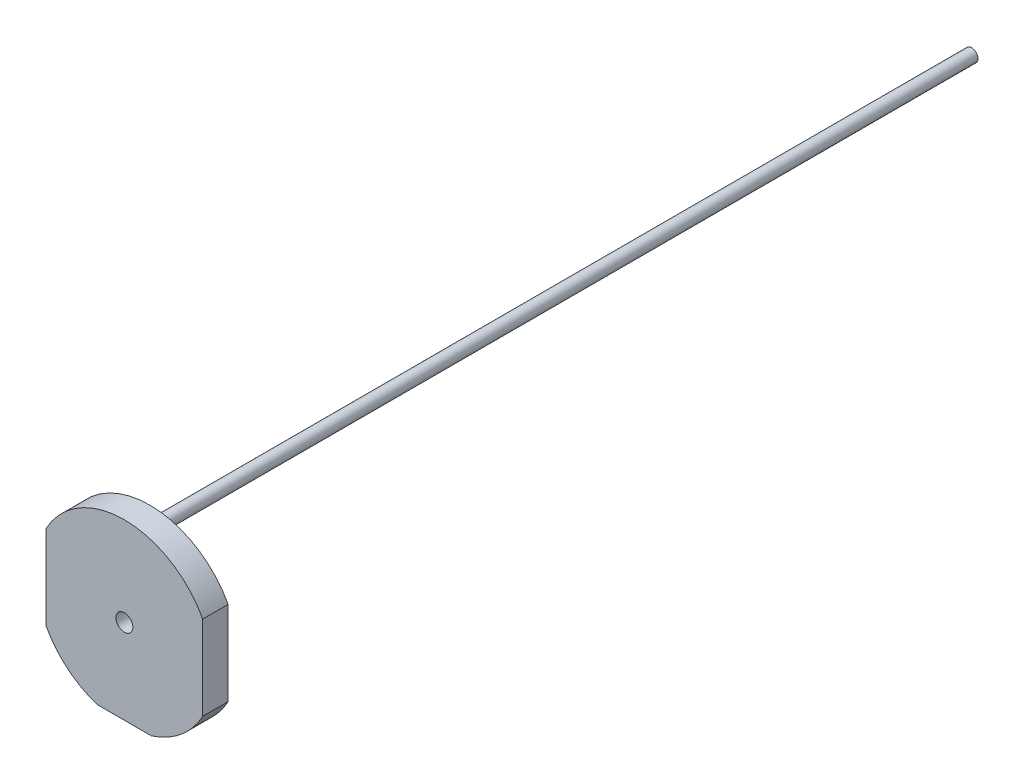
ISO-10303-21;
HEADER;
FILE_DESCRIPTION(('STEP AP214'),'2;1');
FILE_NAME('part.step','',(''),(''),'','','');
FILE_SCHEMA(('AUTOMOTIVE_DESIGN { 1 0 10303 214 1 1 1 1 }'));
ENDSEC;
DATA;
#1=APPLICATION_CONTEXT('core data for automotive mechanical design processes');
#2=APPLICATION_PROTOCOL_DEFINITION('international standard','automotive_design',2000,#1);
#3=PRODUCT_CONTEXT('',#1,'mechanical');
#4=PRODUCT('Part','Part','',(#3));
#5=PRODUCT_RELATED_PRODUCT_CATEGORY('part','',(#4));
#6=PRODUCT_DEFINITION_FORMATION('','',#4);
#7=PRODUCT_DEFINITION_CONTEXT('part definition',#1,'design');
#8=PRODUCT_DEFINITION('design','',#6,#7);
#9=PRODUCT_DEFINITION_SHAPE('','',#8);
#10=(LENGTH_UNIT() NAMED_UNIT(*) SI_UNIT(.MILLI.,.METRE.));
#11=(NAMED_UNIT(*) PLANE_ANGLE_UNIT() SI_UNIT($,.RADIAN.));
#12=(NAMED_UNIT(*) SI_UNIT($,.STERADIAN.) SOLID_ANGLE_UNIT());
#13=UNCERTAINTY_MEASURE_WITH_UNIT(LENGTH_MEASURE(1.E-05),#10,'distance_accuracy_value','');
#14=(GEOMETRIC_REPRESENTATION_CONTEXT(3) GLOBAL_UNCERTAINTY_ASSIGNED_CONTEXT((#13)) GLOBAL_UNIT_ASSIGNED_CONTEXT((#10,
#11,#12)) REPRESENTATION_CONTEXT('',''));
#15=CARTESIAN_POINT('',(0.,0.,0.));
#16=DIRECTION('',(0.,0.,1.));
#17=DIRECTION('',(1.,0.,0.));
#18=AXIS2_PLACEMENT_3D('',#15,#16,#17);
#19=CARTESIAN_POINT('',(0.,0.,-6.));
#20=DIRECTION('',(0.,0.,1.));
#21=DIRECTION('',(1.,0.,0.));
#22=AXIS2_PLACEMENT_3D('',#19,#20,#21);
#23=CYLINDRICAL_SURFACE('',#22,21.);
#24=CARTESIAN_POINT('',(0.,0.,0.));
#25=DIRECTION('',(0.,0.,1.));
#26=DIRECTION('',(1.,0.,0.));
#27=AXIS2_PLACEMENT_3D('',#24,#25,#26);
#28=CIRCLE('',#27,21.);
#29=CARTESIAN_POINT('',(6.40312423743285,-20.,0.));
#30=VERTEX_POINT('',#29);
#31=CARTESIAN_POINT('',(18.5,-9.9373034571759,0.));
#32=VERTEX_POINT('',#31);
#33=EDGE_CURVE('E130',#30,#32,#28,.T.);
#34=ORIENTED_EDGE('',*,*,#33,.F.);
#35=DIRECTION('',(0.,0.,1.));
#36=VECTOR('',#35,1.);
#37=CARTESIAN_POINT('',(6.40312423743285,-20.,-6.));
#38=LINE('',#37,#36);
#39=CARTESIAN_POINT('',(6.40312423743285,-20.,-6.));
#40=VERTEX_POINT('',#39);
#41=EDGE_CURVE('E11',#40,#30,#38,.T.);
#42=ORIENTED_EDGE('',*,*,#41,.F.);
#43=CARTESIAN_POINT('',(0.,0.,-6.));
#44=DIRECTION('',(0.,0.,1.));
#45=DIRECTION('',(1.,0.,0.));
#46=AXIS2_PLACEMENT_3D('',#43,#44,#45);
#47=CIRCLE('',#46,21.);
#48=CARTESIAN_POINT('',(18.5,-9.9373034571759,-6.));
#49=VERTEX_POINT('',#48);
#50=EDGE_CURVE('E151',#40,#49,#47,.T.);
#51=ORIENTED_EDGE('',*,*,#50,.T.);
#52=DIRECTION('',(0.,0.,1.));
#53=VECTOR('',#52,1.);
#54=CARTESIAN_POINT('',(18.5,-9.9373034571759,-6.));
#55=LINE('',#54,#53);
#56=EDGE_CURVE('E42',#49,#32,#55,.T.);
#57=ORIENTED_EDGE('',*,*,#56,.T.);
#58=EDGE_LOOP('',(#34,#42,#51,#57));
#59=FACE_BOUND('',#58,.T.);
#60=ADVANCED_FACE('F39',(#59),#23,.T.);
#61=CARTESIAN_POINT('',(-6.40312423743285,-20.,-6.));
#62=DIRECTION('',(0.,-1.,0.));
#63=DIRECTION('',(0.,0.,-1.));
#64=AXIS2_PLACEMENT_3D('',#61,#62,#63);
#65=PLANE('',#64);
#66=DIRECTION('',(1.,0.,0.));
#67=VECTOR('',#66,1.);
#68=CARTESIAN_POINT('',(-6.40312423743285,-20.,0.));
#69=LINE('',#68,#67);
#70=CARTESIAN_POINT('',(-6.40312423743285,-20.,0.));
#71=VERTEX_POINT('',#70);
#72=EDGE_CURVE('E148',#71,#30,#69,.T.);
#73=ORIENTED_EDGE('',*,*,#72,.F.);
#74=DIRECTION('',(0.,0.,1.));
#75=VECTOR('',#74,1.);
#76=CARTESIAN_POINT('',(-6.40312423743285,-20.,-6.));
#77=LINE('',#76,#75);
#78=CARTESIAN_POINT('',(-6.40312423743285,-20.,-6.));
#79=VERTEX_POINT('',#78);
#80=EDGE_CURVE('E49',#79,#71,#77,.T.);
#81=ORIENTED_EDGE('',*,*,#80,.F.);
#82=DIRECTION('',(1.,0.,0.));
#83=VECTOR('',#82,1.);
#84=CARTESIAN_POINT('',(-6.40312423743285,-20.,-6.));
#85=LINE('',#84,#83);
#86=EDGE_CURVE('E116',#79,#40,#85,.T.);
#87=ORIENTED_EDGE('',*,*,#86,.T.);
#88=ORIENTED_EDGE('',*,*,#41,.T.);
#89=EDGE_LOOP('',(#73,#81,#87,#88));
#90=FACE_BOUND('',#89,.T.);
#91=ADVANCED_FACE('F163',(#90),#65,.T.);
#92=CARTESIAN_POINT('',(0.,0.,-6.));
#93=DIRECTION('',(0.,0.,1.));
#94=DIRECTION('',(1.,0.,0.));
#95=AXIS2_PLACEMENT_3D('',#92,#93,#94);
#96=CYLINDRICAL_SURFACE('',#95,21.);
#97=CARTESIAN_POINT('',(0.,0.,0.));
#98=DIRECTION('',(0.,0.,1.));
#99=DIRECTION('',(1.,0.,0.));
#100=AXIS2_PLACEMENT_3D('',#97,#98,#99);
#101=CIRCLE('',#100,21.);
#102=CARTESIAN_POINT('',(-18.5,-9.9373034571759,0.));
#103=VERTEX_POINT('',#102);
#104=EDGE_CURVE('E102',#103,#71,#101,.T.);
#105=ORIENTED_EDGE('',*,*,#104,.F.);
#106=DIRECTION('',(0.,0.,1.));
#107=VECTOR('',#106,1.);
#108=CARTESIAN_POINT('',(-18.5,-9.9373034571759,-6.));
#109=LINE('',#108,#107);
#110=CARTESIAN_POINT('',(-18.5,-9.9373034571759,-6.));
#111=VERTEX_POINT('',#110);
#112=EDGE_CURVE('E97',#111,#103,#109,.T.);
#113=ORIENTED_EDGE('',*,*,#112,.F.);
#114=CARTESIAN_POINT('',(0.,0.,-6.));
#115=DIRECTION('',(0.,0.,1.));
#116=DIRECTION('',(1.,0.,0.));
#117=AXIS2_PLACEMENT_3D('',#114,#115,#116);
#118=CIRCLE('',#117,21.);
#119=EDGE_CURVE('E100',#111,#79,#118,.T.);
#120=ORIENTED_EDGE('',*,*,#119,.T.);
#121=ORIENTED_EDGE('',*,*,#80,.T.);
#122=EDGE_LOOP('',(#105,#113,#120,#121));
#123=FACE_BOUND('',#122,.T.);
#124=ADVANCED_FACE('F99',(#123),#96,.T.);
#125=CARTESIAN_POINT('',(-18.5,9.9373034571759,-6.));
#126=DIRECTION('',(-1.,0.,0.));
#127=DIRECTION('',(0.,0.,1.));
#128=AXIS2_PLACEMENT_3D('',#125,#126,#127);
#129=PLANE('',#128);
#130=DIRECTION('',(0.,-1.,0.));
#131=VECTOR('',#130,1.);
#132=CARTESIAN_POINT('',(-18.5,9.9373034571759,0.));
#133=LINE('',#132,#131);
#134=CARTESIAN_POINT('',(-18.5,9.9373034571759,0.));
#135=VERTEX_POINT('',#134);
#136=EDGE_CURVE('E143',#135,#103,#133,.T.);
#137=ORIENTED_EDGE('',*,*,#136,.F.);
#138=DIRECTION('',(0.,0.,1.));
#139=VECTOR('',#138,1.);
#140=CARTESIAN_POINT('',(-18.5,9.9373034571759,-6.));
#141=LINE('',#140,#139);
#142=CARTESIAN_POINT('',(-18.5,9.9373034571759,-6.));
#143=VERTEX_POINT('',#142);
#144=EDGE_CURVE('E108',#143,#135,#141,.T.);
#145=ORIENTED_EDGE('',*,*,#144,.F.);
#146=DIRECTION('',(0.,-1.,0.));
#147=VECTOR('',#146,1.);
#148=CARTESIAN_POINT('',(-18.5,9.9373034571759,-6.));
#149=LINE('',#148,#147);
#150=EDGE_CURVE('E114',#143,#111,#149,.T.);
#151=ORIENTED_EDGE('',*,*,#150,.T.);
#152=ORIENTED_EDGE('',*,*,#112,.T.);
#153=EDGE_LOOP('',(#137,#145,#151,#152));
#154=FACE_BOUND('',#153,.T.);
#155=ADVANCED_FACE('F119',(#154),#129,.T.);
#156=CARTESIAN_POINT('',(0.,0.,-6.));
#157=DIRECTION('',(0.,0.,1.));
#158=DIRECTION('',(1.,0.,0.));
#159=AXIS2_PLACEMENT_3D('',#156,#157,#158);
#160=CYLINDRICAL_SURFACE('',#159,21.);
#161=CARTESIAN_POINT('',(0.,0.,0.));
#162=DIRECTION('',(0.,0.,1.));
#163=DIRECTION('',(1.,0.,0.));
#164=AXIS2_PLACEMENT_3D('',#161,#162,#163);
#165=CIRCLE('',#164,21.);
#166=CARTESIAN_POINT('',(18.5,9.9373034571759,0.));
#167=VERTEX_POINT('',#166);
#168=EDGE_CURVE('E139',#167,#135,#165,.T.);
#169=ORIENTED_EDGE('',*,*,#168,.F.);
#170=DIRECTION('',(0.,0.,1.));
#171=VECTOR('',#170,1.);
#172=CARTESIAN_POINT('',(18.5,9.9373034571759,-6.));
#173=LINE('',#172,#171);
#174=CARTESIAN_POINT('',(18.5,9.9373034571759,-6.));
#175=VERTEX_POINT('',#174);
#176=EDGE_CURVE('E156',#175,#167,#173,.T.);
#177=ORIENTED_EDGE('',*,*,#176,.F.);
#178=CARTESIAN_POINT('',(0.,0.,-6.));
#179=DIRECTION('',(0.,0.,1.));
#180=DIRECTION('',(1.,0.,0.));
#181=AXIS2_PLACEMENT_3D('',#178,#179,#180);
#182=CIRCLE('',#181,21.);
#183=EDGE_CURVE('E121',#175,#143,#182,.T.);
#184=ORIENTED_EDGE('',*,*,#183,.T.);
#185=ORIENTED_EDGE('',*,*,#144,.T.);
#186=EDGE_LOOP('',(#169,#177,#184,#185));
#187=FACE_BOUND('',#186,.T.);
#188=ADVANCED_FACE('F176',(#187),#160,.T.);
#189=CARTESIAN_POINT('',(18.5,9.9373034571759,-6.));
#190=DIRECTION('',(1.,0.,0.));
#191=DIRECTION('',(0.,0.,-1.));
#192=AXIS2_PLACEMENT_3D('',#189,#190,#191);
#193=PLANE('',#192);
#194=DIRECTION('',(0.,1.,0.));
#195=VECTOR('',#194,1.);
#196=CARTESIAN_POINT('',(18.5,9.9373034571759,0.));
#197=LINE('',#196,#195);
#198=EDGE_CURVE('E134',#32,#167,#197,.T.);
#199=ORIENTED_EDGE('',*,*,#198,.F.);
#200=ORIENTED_EDGE('',*,*,#56,.F.);
#201=DIRECTION('',(0.,1.,0.));
#202=VECTOR('',#201,1.);
#203=CARTESIAN_POINT('',(18.5,9.9373034571759,-6.));
#204=LINE('',#203,#202);
#205=EDGE_CURVE('E124',#49,#175,#204,.T.);
#206=ORIENTED_EDGE('',*,*,#205,.T.);
#207=ORIENTED_EDGE('',*,*,#176,.T.);
#208=EDGE_LOOP('',(#199,#200,#206,#207));
#209=FACE_BOUND('',#208,.T.);
#210=ADVANCED_FACE('F160',(#209),#193,.T.);
#211=CARTESIAN_POINT('',(0.,0.,-6.));
#212=DIRECTION('',(0.,0.,1.));
#213=DIRECTION('',(1.,0.,0.));
#214=AXIS2_PLACEMENT_3D('',#211,#212,#213);
#215=PLANE('',#214);
#216=CARTESIAN_POINT('',(0.,16.,-6.00000000000001));
#217=DIRECTION('',(0.,0.,1.));
#218=DIRECTION('',(1.,0.,0.));
#219=AXIS2_PLACEMENT_3D('',#216,#217,#218);
#220=CIRCLE('',#219,1.5);
#221=CARTESIAN_POINT('',(1.5,16.,-6.00000000000001));
#222=VERTEX_POINT('',#221);
#223=EDGE_CURVE('E208',#222,#222,#220,.T.);
#224=ORIENTED_EDGE('',*,*,#223,.T.);
#225=EDGE_LOOP('',(#224));
#226=FACE_BOUND('',#225,.T.);
#227=CARTESIAN_POINT('',(0.,0.,-6.));
#228=DIRECTION('',(0.,0.,1.));
#229=DIRECTION('',(1.,0.,0.));
#230=AXIS2_PLACEMENT_3D('',#227,#228,#229);
#231=CIRCLE('',#230,2.);
#232=CARTESIAN_POINT('',(2.,0.,-6.));
#233=VERTEX_POINT('',#232);
#234=EDGE_CURVE('E135',#233,#233,#231,.T.);
#235=ORIENTED_EDGE('',*,*,#234,.T.);
#236=EDGE_LOOP('',(#235));
#237=FACE_BOUND('',#236,.T.);
#238=ORIENTED_EDGE('',*,*,#50,.F.);
#239=ORIENTED_EDGE('',*,*,#86,.F.);
#240=ORIENTED_EDGE('',*,*,#119,.F.);
#241=ORIENTED_EDGE('',*,*,#150,.F.);
#242=ORIENTED_EDGE('',*,*,#183,.F.);
#243=ORIENTED_EDGE('',*,*,#205,.F.);
#244=EDGE_LOOP('',(#238,#239,#240,#241,#242,#243));
#245=FACE_BOUND('',#244,.T.);
#246=ADVANCED_FACE('F112',(#226,#237,#245),#215,.F.);
#247=CARTESIAN_POINT('',(0.,0.,0.));
#248=DIRECTION('',(0.,0.,1.));
#249=DIRECTION('',(1.,0.,0.));
#250=AXIS2_PLACEMENT_3D('',#247,#248,#249);
#251=PLANE('',#250);
#252=CARTESIAN_POINT('',(0.,0.,0.));
#253=DIRECTION('',(0.,0.,1.));
#254=DIRECTION('',(1.,0.,0.));
#255=AXIS2_PLACEMENT_3D('',#252,#253,#254);
#256=CIRCLE('',#255,2.);
#257=CARTESIAN_POINT('',(2.,0.,0.));
#258=VERTEX_POINT('',#257);
#259=EDGE_CURVE('E211',#258,#258,#256,.T.);
#260=ORIENTED_EDGE('',*,*,#259,.F.);
#261=EDGE_LOOP('',(#260));
#262=FACE_BOUND('',#261,.T.);
#263=ORIENTED_EDGE('',*,*,#33,.T.);
#264=ORIENTED_EDGE('',*,*,#198,.T.);
#265=ORIENTED_EDGE('',*,*,#168,.T.);
#266=ORIENTED_EDGE('',*,*,#136,.T.);
#267=ORIENTED_EDGE('',*,*,#104,.T.);
#268=ORIENTED_EDGE('',*,*,#72,.T.);
#269=EDGE_LOOP('',(#263,#264,#265,#266,#267,#268));
#270=FACE_BOUND('',#269,.T.);
#271=ADVANCED_FACE('F162',(#262,#270),#251,.T.);
#272=CARTESIAN_POINT('',(0.,0.,-6.));
#273=DIRECTION('',(0.,0.,1.));
#274=DIRECTION('',(1.,0.,0.));
#275=AXIS2_PLACEMENT_3D('',#272,#273,#274);
#276=CYLINDRICAL_SURFACE('',#275,2.);
#277=ORIENTED_EDGE('',*,*,#234,.F.);
#278=EDGE_LOOP('',(#277));
#279=FACE_BOUND('',#278,.T.);
#280=ORIENTED_EDGE('',*,*,#259,.T.);
#281=EDGE_LOOP('',(#280));
#282=FACE_BOUND('',#281,.T.);
#283=ADVANCED_FACE('F187',(#279,#282),#276,.F.);
#284=CARTESIAN_POINT('',(0.,16.,-200.));
#285=DIRECTION('',(0.,0.,1.));
#286=DIRECTION('',(1.,0.,0.));
#287=AXIS2_PLACEMENT_3D('',#284,#285,#286);
#288=CYLINDRICAL_SURFACE('',#287,1.5);
#289=CARTESIAN_POINT('',(0.,16.,-200.));
#290=DIRECTION('',(0.,0.,1.));
#291=DIRECTION('',(1.,0.,0.));
#292=AXIS2_PLACEMENT_3D('',#289,#290,#291);
#293=CIRCLE('',#292,1.5);
#294=CARTESIAN_POINT('',(1.5,16.,-200.));
#295=VERTEX_POINT('',#294);
#296=EDGE_CURVE('E206',#295,#295,#293,.T.);
#297=ORIENTED_EDGE('',*,*,#296,.T.);
#298=EDGE_LOOP('',(#297));
#299=FACE_BOUND('',#298,.T.);
#300=ORIENTED_EDGE('',*,*,#223,.F.);
#301=EDGE_LOOP('',(#300));
#302=FACE_BOUND('',#301,.T.);
#303=ADVANCED_FACE('F194',(#299,#302),#288,.T.);
#304=CARTESIAN_POINT('',(0.,0.,-200.));
#305=DIRECTION('',(0.,0.,1.));
#306=DIRECTION('',(1.,0.,0.));
#307=AXIS2_PLACEMENT_3D('',#304,#305,#306);
#308=PLANE('',#307);
#309=ORIENTED_EDGE('',*,*,#296,.F.);
#310=EDGE_LOOP('',(#309));
#311=FACE_BOUND('',#310,.T.);
#312=ADVANCED_FACE('F198',(#311),#308,.F.);
#313=CLOSED_SHELL('',(#60,#91,#124,#155,#188,#210,#246,#271,#283,#303,#312));
#314=MANIFOLD_SOLID_BREP('B2',#313);
#315=ADVANCED_BREP_SHAPE_REPRESENTATION('',(#18,#314),#14);
#316=SHAPE_DEFINITION_REPRESENTATION(#9,#315);
ENDSEC;
END-ISO-10303-21;
